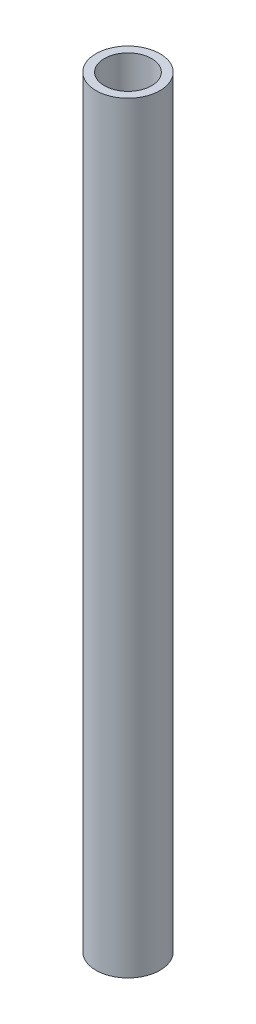
ISO-10303-21;
HEADER;
FILE_DESCRIPTION(('STEP AP214'),'2;1');
FILE_NAME('part.step','',(''),(''),'','','');
FILE_SCHEMA(('AUTOMOTIVE_DESIGN { 1 0 10303 214 1 1 1 1 }'));
ENDSEC;
DATA;
#1=APPLICATION_CONTEXT('core data for automotive mechanical design processes');
#2=APPLICATION_PROTOCOL_DEFINITION('international standard','automotive_design',2000,#1);
#3=PRODUCT_CONTEXT('',#1,'mechanical');
#4=PRODUCT('Part','Part','',(#3));
#5=PRODUCT_RELATED_PRODUCT_CATEGORY('part','',(#4));
#6=PRODUCT_DEFINITION_FORMATION('','',#4);
#7=PRODUCT_DEFINITION_CONTEXT('part definition',#1,'design');
#8=PRODUCT_DEFINITION('design','',#6,#7);
#9=PRODUCT_DEFINITION_SHAPE('','',#8);
#10=(LENGTH_UNIT() NAMED_UNIT(*) SI_UNIT(.MILLI.,.METRE.));
#11=(NAMED_UNIT(*) PLANE_ANGLE_UNIT() SI_UNIT($,.RADIAN.));
#12=(NAMED_UNIT(*) SI_UNIT($,.STERADIAN.) SOLID_ANGLE_UNIT());
#13=UNCERTAINTY_MEASURE_WITH_UNIT(LENGTH_MEASURE(1.E-05),#10,'distance_accuracy_value','');
#14=(GEOMETRIC_REPRESENTATION_CONTEXT(3) GLOBAL_UNCERTAINTY_ASSIGNED_CONTEXT((#13)) GLOBAL_UNIT_ASSIGNED_CONTEXT((#10,
#11,#12)) REPRESENTATION_CONTEXT('',''));
#15=CARTESIAN_POINT('',(0.,0.,0.));
#16=DIRECTION('',(0.,0.,1.));
#17=DIRECTION('',(1.,0.,0.));
#18=AXIS2_PLACEMENT_3D('',#15,#16,#17);
#19=CARTESIAN_POINT('',(0.,127.,0.));
#20=DIRECTION('',(0.,1.,0.));
#21=DIRECTION('',(0.,0.,1.));
#22=AXIS2_PLACEMENT_3D('',#19,#20,#21);
#23=PLANE('',#22);
#24=CARTESIAN_POINT('',(0.,127.,0.));
#25=DIRECTION('',(0.,1.,0.));
#26=DIRECTION('',(0.,0.,1.));
#27=AXIS2_PLACEMENT_3D('',#24,#25,#26);
#28=CIRCLE('',#27,10.668);
#29=CARTESIAN_POINT('',(0.,127.,10.668));
#30=VERTEX_POINT('',#29);
#31=EDGE_CURVE('E10',#30,#30,#28,.T.);
#32=ORIENTED_EDGE('',*,*,#31,.T.);
#33=EDGE_LOOP('',(#32));
#34=FACE_BOUND('',#33,.T.);
#35=CARTESIAN_POINT('',(0.,127.,0.));
#36=DIRECTION('',(0.,1.,0.));
#37=DIRECTION('',(0.,0.,1.));
#38=AXIS2_PLACEMENT_3D('',#35,#36,#37);
#39=CIRCLE('',#38,7.874);
#40=CARTESIAN_POINT('',(0.,127.,7.874));
#41=VERTEX_POINT('',#40);
#42=EDGE_CURVE('E43',#41,#41,#39,.T.);
#43=ORIENTED_EDGE('',*,*,#42,.F.);
#44=EDGE_LOOP('',(#43));
#45=FACE_BOUND('',#44,.T.);
#46=ADVANCED_FACE('F32',(#34,#45),#23,.T.);
#47=CARTESIAN_POINT('',(0.,-127.,0.));
#48=DIRECTION('',(0.,1.,0.));
#49=DIRECTION('',(0.,0.,1.));
#50=AXIS2_PLACEMENT_3D('',#47,#48,#49);
#51=PLANE('',#50);
#52=CARTESIAN_POINT('',(0.,-127.,0.));
#53=DIRECTION('',(0.,1.,0.));
#54=DIRECTION('',(0.,0.,1.));
#55=AXIS2_PLACEMENT_3D('',#52,#53,#54);
#56=CIRCLE('',#55,10.668);
#57=CARTESIAN_POINT('',(0.,-127.,10.668));
#58=VERTEX_POINT('',#57);
#59=EDGE_CURVE('E36',#58,#58,#56,.T.);
#60=ORIENTED_EDGE('',*,*,#59,.F.);
#61=EDGE_LOOP('',(#60));
#62=FACE_BOUND('',#61,.T.);
#63=CARTESIAN_POINT('',(0.,-127.,0.));
#64=DIRECTION('',(0.,1.,0.));
#65=DIRECTION('',(0.,0.,1.));
#66=AXIS2_PLACEMENT_3D('',#63,#64,#65);
#67=CIRCLE('',#66,7.874);
#68=CARTESIAN_POINT('',(0.,-127.,7.874));
#69=VERTEX_POINT('',#68);
#70=EDGE_CURVE('E45',#69,#69,#67,.T.);
#71=ORIENTED_EDGE('',*,*,#70,.T.);
#72=EDGE_LOOP('',(#71));
#73=FACE_BOUND('',#72,.T.);
#74=ADVANCED_FACE('F55',(#62,#73),#51,.F.);
#75=CARTESIAN_POINT('',(0.,127.,0.));
#76=DIRECTION('',(0.,-1.,0.));
#77=DIRECTION('',(0.,0.,-1.));
#78=AXIS2_PLACEMENT_3D('',#75,#76,#77);
#79=CYLINDRICAL_SURFACE('',#78,10.668);
#80=ORIENTED_EDGE('',*,*,#31,.F.);
#81=EDGE_LOOP('',(#80));
#82=FACE_BOUND('',#81,.T.);
#83=ORIENTED_EDGE('',*,*,#59,.T.);
#84=EDGE_LOOP('',(#83));
#85=FACE_BOUND('',#84,.T.);
#86=ADVANCED_FACE('F34',(#82,#85),#79,.T.);
#87=CARTESIAN_POINT('',(0.,127.,0.));
#88=DIRECTION('',(0.,-1.,0.));
#89=DIRECTION('',(0.,0.,-1.));
#90=AXIS2_PLACEMENT_3D('',#87,#88,#89);
#91=CYLINDRICAL_SURFACE('',#90,7.874);
#92=ORIENTED_EDGE('',*,*,#42,.T.);
#93=EDGE_LOOP('',(#92));
#94=FACE_BOUND('',#93,.T.);
#95=ORIENTED_EDGE('',*,*,#70,.F.);
#96=EDGE_LOOP('',(#95));
#97=FACE_BOUND('',#96,.T.);
#98=ADVANCED_FACE('F51',(#94,#97),#91,.F.);
#99=CLOSED_SHELL('',(#46,#74,#86,#98));
#100=MANIFOLD_SOLID_BREP('B2',#99);
#101=ADVANCED_BREP_SHAPE_REPRESENTATION('',(#18,#100),#14);
#102=SHAPE_DEFINITION_REPRESENTATION(#9,#101);
ENDSEC;
END-ISO-10303-21;
